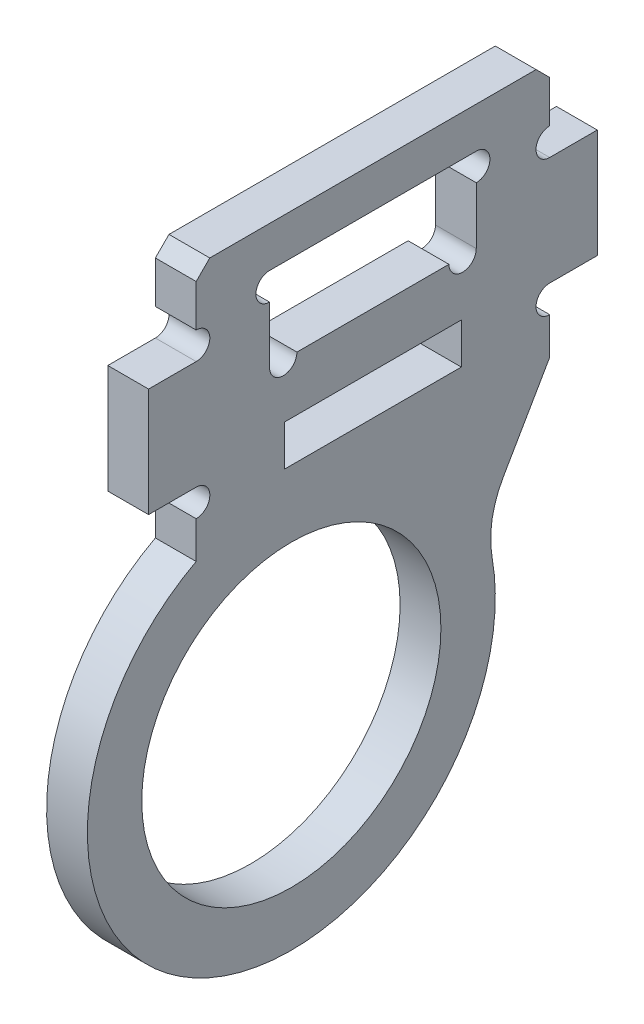
ISO-10303-21;
HEADER;
FILE_DESCRIPTION(('STEP AP214'),'2;1');
FILE_NAME('part.step','',(''),(''),'','','');
FILE_SCHEMA(('AUTOMOTIVE_DESIGN { 1 0 10303 214 1 1 1 1 }'));
ENDSEC;
DATA;
#1=APPLICATION_CONTEXT('core data for automotive mechanical design processes');
#2=APPLICATION_PROTOCOL_DEFINITION('international standard','automotive_design',2000,#1);
#3=PRODUCT_CONTEXT('',#1,'mechanical');
#4=PRODUCT('Part','Part','',(#3));
#5=PRODUCT_RELATED_PRODUCT_CATEGORY('part','',(#4));
#6=PRODUCT_DEFINITION_FORMATION('','',#4);
#7=PRODUCT_DEFINITION_CONTEXT('part definition',#1,'design');
#8=PRODUCT_DEFINITION('design','',#6,#7);
#9=PRODUCT_DEFINITION_SHAPE('','',#8);
#10=(LENGTH_UNIT() NAMED_UNIT(*) SI_UNIT(.MILLI.,.METRE.));
#11=(NAMED_UNIT(*) PLANE_ANGLE_UNIT() SI_UNIT($,.RADIAN.));
#12=(NAMED_UNIT(*) SI_UNIT($,.STERADIAN.) SOLID_ANGLE_UNIT());
#13=UNCERTAINTY_MEASURE_WITH_UNIT(LENGTH_MEASURE(1.E-05),#10,'distance_accuracy_value','');
#14=(GEOMETRIC_REPRESENTATION_CONTEXT(3) GLOBAL_UNCERTAINTY_ASSIGNED_CONTEXT((#13)) GLOBAL_UNIT_ASSIGNED_CONTEXT((#10,
#11,#12)) REPRESENTATION_CONTEXT('',''));
#15=CARTESIAN_POINT('',(0.,0.,0.));
#16=DIRECTION('',(0.,0.,1.));
#17=DIRECTION('',(1.,0.,0.));
#18=AXIS2_PLACEMENT_3D('',#15,#16,#17);
#19=CARTESIAN_POINT('',(3.,0.,13.));
#20=DIRECTION('',(0.,0.,-1.));
#21=DIRECTION('',(-1.,0.,0.));
#22=AXIS2_PLACEMENT_3D('',#19,#20,#21);
#23=PLANE('',#22);
#24=DIRECTION('',(0.,-1.,0.));
#25=VECTOR('',#24,1.);
#26=CARTESIAN_POINT('',(0.,0.,13.));
#27=LINE('',#26,#25);
#28=CARTESIAN_POINT('',(0.,-10.01,13.));
#29=VERTEX_POINT('',#28);
#30=CARTESIAN_POINT('',(0.,-12.7335008385784,13.));
#31=VERTEX_POINT('',#30);
#32=EDGE_CURVE('E436',#29,#31,#27,.T.);
#33=ORIENTED_EDGE('',*,*,#32,.T.);
#34=DIRECTION('',(-1.,0.,0.));
#35=VECTOR('',#34,1.);
#36=CARTESIAN_POINT('',(3.,-12.7335008385784,13.));
#37=LINE('',#36,#35);
#38=CARTESIAN_POINT('',(3.,-12.7335008385784,13.));
#39=VERTEX_POINT('',#38);
#40=EDGE_CURVE('E285',#39,#31,#37,.T.);
#41=ORIENTED_EDGE('',*,*,#40,.F.);
#42=DIRECTION('',(0.,-1.,0.));
#43=VECTOR('',#42,1.);
#44=CARTESIAN_POINT('',(3.,0.,13.));
#45=LINE('',#44,#43);
#46=CARTESIAN_POINT('',(3.,-10.01,13.));
#47=VERTEX_POINT('',#46);
#48=EDGE_CURVE('E506',#47,#39,#45,.T.);
#49=ORIENTED_EDGE('',*,*,#48,.F.);
#50=DIRECTION('',(-1.,0.,0.));
#51=VECTOR('',#50,1.);
#52=CARTESIAN_POINT('',(3.,-10.01,13.));
#53=LINE('',#52,#51);
#54=EDGE_CURVE('E347',#47,#29,#53,.T.);
#55=ORIENTED_EDGE('',*,*,#54,.T.);
#56=EDGE_LOOP('',(#33,#41,#49,#55));
#57=FACE_BOUND('',#56,.T.);
#58=ADVANCED_FACE('F36',(#57),#23,.F.);
#59=CARTESIAN_POINT('',(3.,-26.,6.));
#60=DIRECTION('',(-1.,0.,0.));
#61=DIRECTION('',(0.,0.,1.));
#62=AXIS2_PLACEMENT_3D('',#59,#60,#61);
#63=CYLINDRICAL_SURFACE('',#62,15.);
#64=CARTESIAN_POINT('',(0.,-26.,6.));
#65=DIRECTION('',(1.,0.,0.));
#66=DIRECTION('',(0.,0.,-1.));
#67=AXIS2_PLACEMENT_3D('',#64,#65,#66);
#68=CIRCLE('',#67,15.);
#69=CARTESIAN_POINT('',(0.,-23.3621674574513,-8.76623985574768));
#70=VERTEX_POINT('',#69);
#71=EDGE_CURVE('E439',#31,#70,#68,.T.);
#72=ORIENTED_EDGE('',*,*,#71,.T.);
#73=DIRECTION('',(-1.,0.,0.));
#74=VECTOR('',#73,1.);
#75=CARTESIAN_POINT('',(3.,-23.3621674574513,-8.76623985574768));
#76=LINE('',#75,#74);
#77=CARTESIAN_POINT('',(3.,-23.3621674574513,-8.76623985574768));
#78=VERTEX_POINT('',#77);
#79=EDGE_CURVE('E284',#70,#78,#76,.F.);
#80=ORIENTED_EDGE('',*,*,#79,.T.);
#81=CARTESIAN_POINT('',(3.,-26.,6.));
#82=DIRECTION('',(1.,0.,0.));
#83=DIRECTION('',(0.,0.,-1.));
#84=AXIS2_PLACEMENT_3D('',#81,#82,#83);
#85=CIRCLE('',#84,15.);
#86=EDGE_CURVE('E503',#39,#78,#85,.T.);
#87=ORIENTED_EDGE('',*,*,#86,.F.);
#88=ORIENTED_EDGE('',*,*,#40,.T.);
#89=EDGE_LOOP('',(#72,#80,#87,#88));
#90=FACE_BOUND('',#89,.T.);
#91=ADVANCED_FACE('F496',(#90),#63,.T.);
#92=CARTESIAN_POINT('',(3.,-8.81254033424348,-15.2637676026597));
#93=DIRECTION('',(0.,-0.500000000000001,-0.866025403784438));
#94=DIRECTION('',(0.,0.866025403784438,-0.500000000000001));
#95=AXIS2_PLACEMENT_3D('',#92,#93,#94);
#96=PLANE('',#95);
#97=DIRECTION('',(0.,-0.866025403784438,0.500000000000001));
#98=VECTOR('',#97,1.);
#99=CARTESIAN_POINT('',(3.,-8.81254033424348,-15.2637676026597));
#100=LINE('',#99,#98);
#101=CARTESIAN_POINT('',(3.,-12.7335008385784,-13.));
#102=VERTEX_POINT('',#101);
#103=CARTESIAN_POINT('',(3.,-18.6311789375952,-9.59497396193886));
#104=VERTEX_POINT('',#103);
#105=EDGE_CURVE('E501',#102,#104,#100,.T.);
#106=ORIENTED_EDGE('',*,*,#105,.T.);
#107=DIRECTION('',(-1.,0.,0.));
#108=VECTOR('',#107,1.);
#109=CARTESIAN_POINT('',(3.,-18.6311789375952,-9.59497396193886));
#110=LINE('',#109,#108);
#111=CARTESIAN_POINT('',(0.,-18.6311789375952,-9.59497396193886));
#112=VERTEX_POINT('',#111);
#113=EDGE_CURVE('E281',#104,#112,#110,.T.);
#114=ORIENTED_EDGE('',*,*,#113,.T.);
#115=DIRECTION('',(0.,-0.866025403784438,0.500000000000001));
#116=VECTOR('',#115,1.);
#117=CARTESIAN_POINT('',(0.,-8.81254033424348,-15.2637676026597));
#118=LINE('',#117,#116);
#119=CARTESIAN_POINT('',(0.,-12.7335008385784,-13.));
#120=VERTEX_POINT('',#119);
#121=EDGE_CURVE('E442',#120,#112,#118,.T.);
#122=ORIENTED_EDGE('',*,*,#121,.F.);
#123=DIRECTION('',(-1.,0.,0.));
#124=VECTOR('',#123,1.);
#125=CARTESIAN_POINT('',(3.,-12.7335008385784,-13.));
#126=LINE('',#125,#124);
#127=EDGE_CURVE('E374',#102,#120,#126,.T.);
#128=ORIENTED_EDGE('',*,*,#127,.F.);
#129=EDGE_LOOP('',(#106,#114,#122,#128));
#130=FACE_BOUND('',#129,.T.);
#131=ADVANCED_FACE('F490',(#130),#96,.T.);
#132=CARTESIAN_POINT('',(3.,0.,-13.));
#133=DIRECTION('',(0.,0.,-1.));
#134=DIRECTION('',(-1.,0.,0.));
#135=AXIS2_PLACEMENT_3D('',#132,#133,#134);
#136=PLANE('',#135);
#137=DIRECTION('',(0.,-1.,0.));
#138=VECTOR('',#137,1.);
#139=CARTESIAN_POINT('',(0.,0.,-13.));
#140=LINE('',#139,#138);
#141=CARTESIAN_POINT('',(0.,-10.01,-13.));
#142=VERTEX_POINT('',#141);
#143=EDGE_CURVE('E445',#142,#120,#140,.T.);
#144=ORIENTED_EDGE('',*,*,#143,.F.);
#145=DIRECTION('',(-1.,0.,0.));
#146=VECTOR('',#145,1.);
#147=CARTESIAN_POINT('',(3.,-10.01,-13.));
#148=LINE('',#147,#146);
#149=CARTESIAN_POINT('',(3.,-10.01,-13.));
#150=VERTEX_POINT('',#149);
#151=EDGE_CURVE('E372',#150,#142,#148,.T.);
#152=ORIENTED_EDGE('',*,*,#151,.F.);
#153=DIRECTION('',(0.,-1.,0.));
#154=VECTOR('',#153,1.);
#155=CARTESIAN_POINT('',(3.,0.,-13.));
#156=LINE('',#155,#154);
#157=EDGE_CURVE('E486',#150,#102,#156,.T.);
#158=ORIENTED_EDGE('',*,*,#157,.T.);
#159=ORIENTED_EDGE('',*,*,#127,.T.);
#160=EDGE_LOOP('',(#144,#152,#158,#159));
#161=FACE_BOUND('',#160,.T.);
#162=ADVANCED_FACE('F484',(#161),#136,.T.);
#163=CARTESIAN_POINT('',(3.,-9.005,-13.));
#164=DIRECTION('',(-1.,0.,0.));
#165=DIRECTION('',(0.,0.,1.));
#166=AXIS2_PLACEMENT_3D('',#163,#164,#165);
#167=CYLINDRICAL_SURFACE('',#166,1.005);
#168=CARTESIAN_POINT('',(0.,-9.005,-13.));
#169=DIRECTION('',(1.,0.,0.));
#170=DIRECTION('',(0.,0.,-1.));
#171=AXIS2_PLACEMENT_3D('',#168,#169,#170);
#172=CIRCLE('',#171,1.005);
#173=CARTESIAN_POINT('',(0.,-8.,-13.));
#174=VERTEX_POINT('',#173);
#175=EDGE_CURVE('E448',#174,#142,#172,.T.);
#176=ORIENTED_EDGE('',*,*,#175,.F.);
#177=DIRECTION('',(-1.,0.,0.));
#178=VECTOR('',#177,1.);
#179=CARTESIAN_POINT('',(3.,-8.,-13.));
#180=LINE('',#179,#178);
#181=CARTESIAN_POINT('',(3.,-8.,-13.));
#182=VERTEX_POINT('',#181);
#183=EDGE_CURVE('E370',#182,#174,#180,.T.);
#184=ORIENTED_EDGE('',*,*,#183,.F.);
#185=CARTESIAN_POINT('',(3.,-9.005,-13.));
#186=DIRECTION('',(1.,0.,0.));
#187=DIRECTION('',(0.,0.,-1.));
#188=AXIS2_PLACEMENT_3D('',#185,#186,#187);
#189=CIRCLE('',#188,1.005);
#190=EDGE_CURVE('E480',#182,#150,#189,.T.);
#191=ORIENTED_EDGE('',*,*,#190,.T.);
#192=ORIENTED_EDGE('',*,*,#151,.T.);
#193=EDGE_LOOP('',(#176,#184,#191,#192));
#194=FACE_BOUND('',#193,.T.);
#195=ADVANCED_FACE('F477',(#194),#167,.F.);
#196=CARTESIAN_POINT('',(3.,-8.00000000000001,0.));
#197=DIRECTION('',(0.,-1.,0.));
#198=DIRECTION('',(0.,0.,-1.));
#199=AXIS2_PLACEMENT_3D('',#196,#197,#198);
#200=PLANE('',#199);
#201=DIRECTION('',(0.,0.,1.));
#202=VECTOR('',#201,1.);
#203=CARTESIAN_POINT('',(0.,-8.00000000000001,0.));
#204=LINE('',#203,#202);
#205=CARTESIAN_POINT('',(0.,-8.,-16.5));
#206=VERTEX_POINT('',#205);
#207=EDGE_CURVE('E451',#206,#174,#204,.T.);
#208=ORIENTED_EDGE('',*,*,#207,.F.);
#209=DIRECTION('',(-1.,0.,0.));
#210=VECTOR('',#209,1.);
#211=CARTESIAN_POINT('',(3.,-8.,-16.5));
#212=LINE('',#211,#210);
#213=CARTESIAN_POINT('',(3.,-8.,-16.5));
#214=VERTEX_POINT('',#213);
#215=EDGE_CURVE('E368',#214,#206,#212,.T.);
#216=ORIENTED_EDGE('',*,*,#215,.F.);
#217=DIRECTION('',(0.,0.,1.));
#218=VECTOR('',#217,1.);
#219=CARTESIAN_POINT('',(3.,-8.00000000000001,0.));
#220=LINE('',#219,#218);
#221=EDGE_CURVE('E511',#214,#182,#220,.T.);
#222=ORIENTED_EDGE('',*,*,#221,.T.);
#223=ORIENTED_EDGE('',*,*,#183,.T.);
#224=EDGE_LOOP('',(#208,#216,#222,#223));
#225=FACE_BOUND('',#224,.T.);
#226=ADVANCED_FACE('F473',(#225),#200,.T.);
#227=CARTESIAN_POINT('',(3.,0.,-16.5));
#228=DIRECTION('',(0.,0.,-1.));
#229=DIRECTION('',(-1.,0.,0.));
#230=AXIS2_PLACEMENT_3D('',#227,#228,#229);
#231=PLANE('',#230);
#232=DIRECTION('',(0.,-1.,0.));
#233=VECTOR('',#232,1.);
#234=CARTESIAN_POINT('',(0.,0.,-16.5));
#235=LINE('',#234,#233);
#236=CARTESIAN_POINT('',(0.,0.,-16.5));
#237=VERTEX_POINT('',#236);
#238=EDGE_CURVE('E454',#237,#206,#235,.T.);
#239=ORIENTED_EDGE('',*,*,#238,.F.);
#240=DIRECTION('',(-1.,0.,0.));
#241=VECTOR('',#240,1.);
#242=CARTESIAN_POINT('',(3.,0.,-16.5));
#243=LINE('',#242,#241);
#244=CARTESIAN_POINT('',(3.,0.,-16.5));
#245=VERTEX_POINT('',#244);
#246=EDGE_CURVE('E366',#245,#237,#243,.T.);
#247=ORIENTED_EDGE('',*,*,#246,.F.);
#248=DIRECTION('',(0.,-1.,0.));
#249=VECTOR('',#248,1.);
#250=CARTESIAN_POINT('',(3.,0.,-16.5));
#251=LINE('',#250,#249);
#252=EDGE_CURVE('E469',#245,#214,#251,.T.);
#253=ORIENTED_EDGE('',*,*,#252,.T.);
#254=ORIENTED_EDGE('',*,*,#215,.T.);
#255=EDGE_LOOP('',(#239,#247,#253,#254));
#256=FACE_BOUND('',#255,.T.);
#257=ADVANCED_FACE('F467',(#256),#231,.T.);
#258=CARTESIAN_POINT('',(3.,0.,0.));
#259=DIRECTION('',(0.,1.,0.));
#260=DIRECTION('',(0.,0.,1.));
#261=AXIS2_PLACEMENT_3D('',#258,#259,#260);
#262=PLANE('',#261);
#263=DIRECTION('',(0.,0.,-1.));
#264=VECTOR('',#263,1.);
#265=CARTESIAN_POINT('',(0.,0.,0.));
#266=LINE('',#265,#264);
#267=CARTESIAN_POINT('',(0.,0.,-13.));
#268=VERTEX_POINT('',#267);
#269=EDGE_CURVE('E330',#268,#237,#266,.T.);
#270=ORIENTED_EDGE('',*,*,#269,.F.);
#271=DIRECTION('',(-1.,0.,0.));
#272=VECTOR('',#271,1.);
#273=CARTESIAN_POINT('',(3.,0.,-13.));
#274=LINE('',#273,#272);
#275=CARTESIAN_POINT('',(3.,0.,-13.));
#276=VERTEX_POINT('',#275);
#277=EDGE_CURVE('E364',#276,#268,#274,.T.);
#278=ORIENTED_EDGE('',*,*,#277,.F.);
#279=DIRECTION('',(0.,0.,-1.));
#280=VECTOR('',#279,1.);
#281=CARTESIAN_POINT('',(3.,0.,0.));
#282=LINE('',#281,#280);
#283=EDGE_CURVE('E463',#276,#245,#282,.T.);
#284=ORIENTED_EDGE('',*,*,#283,.T.);
#285=ORIENTED_EDGE('',*,*,#246,.T.);
#286=EDGE_LOOP('',(#270,#278,#284,#285));
#287=FACE_BOUND('',#286,.T.);
#288=ADVANCED_FACE('F460',(#287),#262,.T.);
#289=CARTESIAN_POINT('',(3.,1.005,-13.));
#290=DIRECTION('',(-1.,0.,0.));
#291=DIRECTION('',(0.,0.,1.));
#292=AXIS2_PLACEMENT_3D('',#289,#290,#291);
#293=CYLINDRICAL_SURFACE('',#292,1.005);
#294=CARTESIAN_POINT('',(0.,1.005,-13.));
#295=DIRECTION('',(1.,0.,0.));
#296=DIRECTION('',(0.,0.,-1.));
#297=AXIS2_PLACEMENT_3D('',#294,#295,#296);
#298=CIRCLE('',#297,1.005);
#299=CARTESIAN_POINT('',(0.,2.01,-13.));
#300=VERTEX_POINT('',#299);
#301=EDGE_CURVE('E326',#300,#268,#298,.T.);
#302=ORIENTED_EDGE('',*,*,#301,.F.);
#303=DIRECTION('',(-1.,0.,0.));
#304=VECTOR('',#303,1.);
#305=CARTESIAN_POINT('',(3.,2.01,-13.));
#306=LINE('',#305,#304);
#307=CARTESIAN_POINT('',(3.,2.01,-13.));
#308=VERTEX_POINT('',#307);
#309=EDGE_CURVE('E324',#308,#300,#306,.T.);
#310=ORIENTED_EDGE('',*,*,#309,.F.);
#311=CARTESIAN_POINT('',(3.,1.005,-13.));
#312=DIRECTION('',(1.,0.,0.));
#313=DIRECTION('',(0.,0.,-1.));
#314=AXIS2_PLACEMENT_3D('',#311,#312,#313);
#315=CIRCLE('',#314,1.005);
#316=EDGE_CURVE('E515',#308,#276,#315,.T.);
#317=ORIENTED_EDGE('',*,*,#316,.T.);
#318=ORIENTED_EDGE('',*,*,#277,.T.);
#319=EDGE_LOOP('',(#302,#310,#317,#318));
#320=FACE_BOUND('',#319,.T.);
#321=ADVANCED_FACE('F694',(#320),#293,.F.);
#322=CARTESIAN_POINT('',(3.,0.,-13.));
#323=DIRECTION('',(0.,0.,-1.));
#324=DIRECTION('',(-1.,0.,0.));
#325=AXIS2_PLACEMENT_3D('',#322,#323,#324);
#326=PLANE('',#325);
#327=DIRECTION('',(0.,-1.,0.));
#328=VECTOR('',#327,1.);
#329=CARTESIAN_POINT('',(0.,0.,-13.));
#330=LINE('',#329,#328);
#331=CARTESIAN_POINT('',(0.,5.09999999999999,-13.));
#332=VERTEX_POINT('',#331);
#333=EDGE_CURVE('E319',#332,#300,#330,.T.);
#334=ORIENTED_EDGE('',*,*,#333,.F.);
#335=DIRECTION('',(1.,0.,0.));
#336=VECTOR('',#335,1.);
#337=CARTESIAN_POINT('',(3.,5.09999999999999,-13.));
#338=LINE('',#337,#336);
#339=CARTESIAN_POINT('',(3.,5.09999999999999,-13.));
#340=VERTEX_POINT('',#339);
#341=EDGE_CURVE('E59',#332,#340,#338,.T.);
#342=ORIENTED_EDGE('',*,*,#341,.T.);
#343=DIRECTION('',(0.,-1.,0.));
#344=VECTOR('',#343,1.);
#345=CARTESIAN_POINT('',(3.,0.,-13.));
#346=LINE('',#345,#344);
#347=EDGE_CURVE('E305',#340,#308,#346,.T.);
#348=ORIENTED_EDGE('',*,*,#347,.T.);
#349=ORIENTED_EDGE('',*,*,#309,.T.);
#350=EDGE_LOOP('',(#334,#342,#348,#349));
#351=FACE_BOUND('',#350,.T.);
#352=ADVANCED_FACE('F322',(#351),#326,.T.);
#353=CARTESIAN_POINT('',(3.,6.1,0.));
#354=DIRECTION('',(0.,1.,0.));
#355=DIRECTION('',(0.,0.,1.));
#356=AXIS2_PLACEMENT_3D('',#353,#354,#355);
#357=PLANE('',#356);
#358=DIRECTION('',(0.,0.,-1.));
#359=VECTOR('',#358,1.);
#360=CARTESIAN_POINT('',(3.,6.1,0.));
#361=LINE('',#360,#359);
#362=CARTESIAN_POINT('',(3.,6.1,12.));
#363=VERTEX_POINT('',#362);
#364=CARTESIAN_POINT('',(3.,6.1,-12.));
#365=VERTEX_POINT('',#364);
#366=EDGE_CURVE('E303',#363,#365,#361,.T.);
#367=ORIENTED_EDGE('',*,*,#366,.T.);
#368=DIRECTION('',(-1.,0.,0.));
#369=VECTOR('',#368,1.);
#370=CARTESIAN_POINT('',(3.,6.1,-12.));
#371=LINE('',#370,#369);
#372=CARTESIAN_POINT('',(0.,6.1,-12.));
#373=VERTEX_POINT('',#372);
#374=EDGE_CURVE('E293',#365,#373,#371,.T.);
#375=ORIENTED_EDGE('',*,*,#374,.T.);
#376=DIRECTION('',(0.,0.,-1.));
#377=VECTOR('',#376,1.);
#378=CARTESIAN_POINT('',(0.,6.1,0.));
#379=LINE('',#378,#377);
#380=CARTESIAN_POINT('',(0.,6.1,12.));
#381=VERTEX_POINT('',#380);
#382=EDGE_CURVE('E321',#381,#373,#379,.T.);
#383=ORIENTED_EDGE('',*,*,#382,.F.);
#384=DIRECTION('',(1.,0.,0.));
#385=VECTOR('',#384,1.);
#386=CARTESIAN_POINT('',(3.,6.1,12.));
#387=LINE('',#386,#385);
#388=EDGE_CURVE('E291',#381,#363,#387,.T.);
#389=ORIENTED_EDGE('',*,*,#388,.T.);
#390=EDGE_LOOP('',(#367,#375,#383,#389));
#391=FACE_BOUND('',#390,.T.);
#392=ADVANCED_FACE('F309',(#391),#357,.T.);
#393=CARTESIAN_POINT('',(3.,0.,13.));
#394=DIRECTION('',(0.,0.,-1.));
#395=DIRECTION('',(-1.,0.,0.));
#396=AXIS2_PLACEMENT_3D('',#393,#394,#395);
#397=PLANE('',#396);
#398=DIRECTION('',(0.,-1.,0.));
#399=VECTOR('',#398,1.);
#400=CARTESIAN_POINT('',(3.,0.,13.));
#401=LINE('',#400,#399);
#402=CARTESIAN_POINT('',(3.,5.09999999999999,13.));
#403=VERTEX_POINT('',#402);
#404=CARTESIAN_POINT('',(3.,2.01,13.));
#405=VERTEX_POINT('',#404);
#406=EDGE_CURVE('E313',#403,#405,#401,.T.);
#407=ORIENTED_EDGE('',*,*,#406,.F.);
#408=DIRECTION('',(-1.,0.,0.));
#409=VECTOR('',#408,1.);
#410=CARTESIAN_POINT('',(0.,5.09999999999999,13.));
#411=LINE('',#410,#409);
#412=CARTESIAN_POINT('',(0.,5.09999999999999,13.));
#413=VERTEX_POINT('',#412);
#414=EDGE_CURVE('E11',#403,#413,#411,.T.);
#415=ORIENTED_EDGE('',*,*,#414,.T.);
#416=DIRECTION('',(0.,-1.,0.));
#417=VECTOR('',#416,1.);
#418=CARTESIAN_POINT('',(0.,0.,13.));
#419=LINE('',#418,#417);
#420=CARTESIAN_POINT('',(0.,2.01,13.));
#421=VERTEX_POINT('',#420);
#422=EDGE_CURVE('E328',#413,#421,#419,.T.);
#423=ORIENTED_EDGE('',*,*,#422,.T.);
#424=DIRECTION('',(-1.,0.,0.));
#425=VECTOR('',#424,1.);
#426=CARTESIAN_POINT('',(3.,2.01,13.));
#427=LINE('',#426,#425);
#428=EDGE_CURVE('E360',#405,#421,#427,.T.);
#429=ORIENTED_EDGE('',*,*,#428,.F.);
#430=EDGE_LOOP('',(#407,#415,#423,#429));
#431=FACE_BOUND('',#430,.T.);
#432=ADVANCED_FACE('F664',(#431),#397,.F.);
#433=CARTESIAN_POINT('',(3.,1.005,13.));
#434=DIRECTION('',(-1.,0.,0.));
#435=DIRECTION('',(0.,0.,1.));
#436=AXIS2_PLACEMENT_3D('',#433,#434,#435);
#437=CYLINDRICAL_SURFACE('',#436,1.005);
#438=CARTESIAN_POINT('',(0.,1.005,13.));
#439=DIRECTION('',(1.,0.,0.));
#440=DIRECTION('',(0.,0.,-1.));
#441=AXIS2_PLACEMENT_3D('',#438,#439,#440);
#442=CIRCLE('',#441,1.005);
#443=CARTESIAN_POINT('',(0.,0.,13.));
#444=VERTEX_POINT('',#443);
#445=EDGE_CURVE('E335',#444,#421,#442,.T.);
#446=ORIENTED_EDGE('',*,*,#445,.F.);
#447=DIRECTION('',(-1.,0.,0.));
#448=VECTOR('',#447,1.);
#449=CARTESIAN_POINT('',(3.,0.,13.));
#450=LINE('',#449,#448);
#451=CARTESIAN_POINT('',(3.,0.,13.));
#452=VERTEX_POINT('',#451);
#453=EDGE_CURVE('E358',#452,#444,#450,.T.);
#454=ORIENTED_EDGE('',*,*,#453,.F.);
#455=CARTESIAN_POINT('',(3.,1.005,13.));
#456=DIRECTION('',(1.,0.,0.));
#457=DIRECTION('',(0.,0.,-1.));
#458=AXIS2_PLACEMENT_3D('',#455,#456,#457);
#459=CIRCLE('',#458,1.005);
#460=EDGE_CURVE('E520',#452,#405,#459,.T.);
#461=ORIENTED_EDGE('',*,*,#460,.T.);
#462=ORIENTED_EDGE('',*,*,#428,.T.);
#463=EDGE_LOOP('',(#446,#454,#461,#462));
#464=FACE_BOUND('',#463,.T.);
#465=ADVANCED_FACE('F669',(#464),#437,.F.);
#466=CARTESIAN_POINT('',(3.,0.,0.));
#467=DIRECTION('',(0.,-1.,0.));
#468=DIRECTION('',(0.,0.,-1.));
#469=AXIS2_PLACEMENT_3D('',#466,#467,#468);
#470=PLANE('',#469);
#471=DIRECTION('',(0.,0.,1.));
#472=VECTOR('',#471,1.);
#473=CARTESIAN_POINT('',(0.,0.,0.));
#474=LINE('',#473,#472);
#475=CARTESIAN_POINT('',(0.,0.,16.5));
#476=VERTEX_POINT('',#475);
#477=EDGE_CURVE('E338',#444,#476,#474,.T.);
#478=ORIENTED_EDGE('',*,*,#477,.T.);
#479=DIRECTION('',(-1.,0.,0.));
#480=VECTOR('',#479,1.);
#481=CARTESIAN_POINT('',(3.,0.,16.5));
#482=LINE('',#481,#480);
#483=CARTESIAN_POINT('',(3.,0.,16.5));
#484=VERTEX_POINT('',#483);
#485=EDGE_CURVE('E355',#484,#476,#482,.T.);
#486=ORIENTED_EDGE('',*,*,#485,.F.);
#487=DIRECTION('',(0.,0.,1.));
#488=VECTOR('',#487,1.);
#489=CARTESIAN_POINT('',(3.,0.,0.));
#490=LINE('',#489,#488);
#491=EDGE_CURVE('E523',#452,#484,#490,.T.);
#492=ORIENTED_EDGE('',*,*,#491,.F.);
#493=ORIENTED_EDGE('',*,*,#453,.T.);
#494=EDGE_LOOP('',(#478,#486,#492,#493));
#495=FACE_BOUND('',#494,.T.);
#496=ADVANCED_FACE('F674',(#495),#470,.F.);
#497=CARTESIAN_POINT('',(3.,0.,16.5));
#498=DIRECTION('',(0.,0.,-1.));
#499=DIRECTION('',(-1.,0.,0.));
#500=AXIS2_PLACEMENT_3D('',#497,#498,#499);
#501=PLANE('',#500);
#502=DIRECTION('',(0.,-1.,0.));
#503=VECTOR('',#502,1.);
#504=CARTESIAN_POINT('',(0.,0.,16.5));
#505=LINE('',#504,#503);
#506=CARTESIAN_POINT('',(0.,-8.,16.5));
#507=VERTEX_POINT('',#506);
#508=EDGE_CURVE('E340',#476,#507,#505,.T.);
#509=ORIENTED_EDGE('',*,*,#508,.T.);
#510=DIRECTION('',(-1.,0.,0.));
#511=VECTOR('',#510,1.);
#512=CARTESIAN_POINT('',(3.,-8.,16.5));
#513=LINE('',#512,#511);
#514=CARTESIAN_POINT('',(3.,-8.,16.5));
#515=VERTEX_POINT('',#514);
#516=EDGE_CURVE('E352',#515,#507,#513,.T.);
#517=ORIENTED_EDGE('',*,*,#516,.F.);
#518=DIRECTION('',(0.,-1.,0.));
#519=VECTOR('',#518,1.);
#520=CARTESIAN_POINT('',(3.,0.,16.5));
#521=LINE('',#520,#519);
#522=EDGE_CURVE('E525',#484,#515,#521,.T.);
#523=ORIENTED_EDGE('',*,*,#522,.F.);
#524=ORIENTED_EDGE('',*,*,#485,.T.);
#525=EDGE_LOOP('',(#509,#517,#523,#524));
#526=FACE_BOUND('',#525,.T.);
#527=ADVANCED_FACE('F676',(#526),#501,.F.);
#528=CARTESIAN_POINT('',(3.,-8.00000000000002,0.));
#529=DIRECTION('',(0.,1.,0.));
#530=DIRECTION('',(0.,0.,1.));
#531=AXIS2_PLACEMENT_3D('',#528,#529,#530);
#532=PLANE('',#531);
#533=DIRECTION('',(0.,0.,-1.));
#534=VECTOR('',#533,1.);
#535=CARTESIAN_POINT('',(0.,-8.00000000000002,0.));
#536=LINE('',#535,#534);
#537=CARTESIAN_POINT('',(0.,-8.00000000000001,13.));
#538=VERTEX_POINT('',#537);
#539=EDGE_CURVE('E342',#507,#538,#536,.T.);
#540=ORIENTED_EDGE('',*,*,#539,.T.);
#541=DIRECTION('',(-1.,0.,0.));
#542=VECTOR('',#541,1.);
#543=CARTESIAN_POINT('',(3.,-8.00000000000001,13.));
#544=LINE('',#543,#542);
#545=CARTESIAN_POINT('',(3.,-8.00000000000001,13.));
#546=VERTEX_POINT('',#545);
#547=EDGE_CURVE('E349',#546,#538,#544,.T.);
#548=ORIENTED_EDGE('',*,*,#547,.F.);
#549=DIRECTION('',(0.,0.,-1.));
#550=VECTOR('',#549,1.);
#551=CARTESIAN_POINT('',(3.,-8.00000000000002,0.));
#552=LINE('',#551,#550);
#553=EDGE_CURVE('E527',#515,#546,#552,.T.);
#554=ORIENTED_EDGE('',*,*,#553,.F.);
#555=ORIENTED_EDGE('',*,*,#516,.T.);
#556=EDGE_LOOP('',(#540,#548,#554,#555));
#557=FACE_BOUND('',#556,.T.);
#558=ADVANCED_FACE('F541',(#557),#532,.F.);
#559=CARTESIAN_POINT('',(3.,2.095,7.6));
#560=DIRECTION('',(-1.,0.,0.));
#561=DIRECTION('',(0.,0.,1.));
#562=AXIS2_PLACEMENT_3D('',#559,#560,#561);
#563=CYLINDRICAL_SURFACE('',#562,1.005);
#564=CARTESIAN_POINT('',(0.,2.095,7.6));
#565=DIRECTION('',(1.,0.,0.));
#566=DIRECTION('',(0.,0.,-1.));
#567=AXIS2_PLACEMENT_3D('',#564,#565,#566);
#568=CIRCLE('',#567,1.005);
#569=CARTESIAN_POINT('',(0.,3.1,7.6));
#570=VERTEX_POINT('',#569);
#571=CARTESIAN_POINT('',(0.,1.09,7.6));
#572=VERTEX_POINT('',#571);
#573=EDGE_CURVE('E409',#570,#572,#568,.T.);
#574=ORIENTED_EDGE('',*,*,#573,.F.);
#575=DIRECTION('',(-1.,0.,0.));
#576=VECTOR('',#575,1.);
#577=CARTESIAN_POINT('',(3.,3.1,7.6));
#578=LINE('',#577,#576);
#579=CARTESIAN_POINT('',(3.,3.1,7.6));
#580=VERTEX_POINT('',#579);
#581=EDGE_CURVE('E350',#580,#570,#578,.T.);
#582=ORIENTED_EDGE('',*,*,#581,.F.);
#583=CARTESIAN_POINT('',(3.,2.095,7.6));
#584=DIRECTION('',(1.,0.,0.));
#585=DIRECTION('',(0.,0.,-1.));
#586=AXIS2_PLACEMENT_3D('',#583,#584,#585);
#587=CIRCLE('',#586,1.005);
#588=CARTESIAN_POINT('',(3.,1.09,7.6));
#589=VERTEX_POINT('',#588);
#590=EDGE_CURVE('E565',#580,#589,#587,.T.);
#591=ORIENTED_EDGE('',*,*,#590,.T.);
#592=DIRECTION('',(-1.,0.,0.));
#593=VECTOR('',#592,1.);
#594=CARTESIAN_POINT('',(3.,1.09,7.6));
#595=LINE('',#594,#593);
#596=EDGE_CURVE('E273',#589,#572,#595,.T.);
#597=ORIENTED_EDGE('',*,*,#596,.T.);
#598=EDGE_LOOP('',(#574,#582,#591,#597));
#599=FACE_BOUND('',#598,.T.);
#600=ADVANCED_FACE('F612',(#599),#563,.F.);
#601=CARTESIAN_POINT('',(3.,3.1,0.));
#602=DIRECTION('',(0.,-1.,0.));
#603=DIRECTION('',(0.,0.,-1.));
#604=AXIS2_PLACEMENT_3D('',#601,#602,#603);
#605=PLANE('',#604);
#606=DIRECTION('',(0.,0.,1.));
#607=VECTOR('',#606,1.);
#608=CARTESIAN_POINT('',(0.,3.1,0.));
#609=LINE('',#608,#607);
#610=CARTESIAN_POINT('',(0.,3.1,-7.6));
#611=VERTEX_POINT('',#610);
#612=EDGE_CURVE('E415',#611,#570,#609,.T.);
#613=ORIENTED_EDGE('',*,*,#612,.F.);
#614=DIRECTION('',(-1.,0.,0.));
#615=VECTOR('',#614,1.);
#616=CARTESIAN_POINT('',(3.,3.1,-7.6));
#617=LINE('',#616,#615);
#618=CARTESIAN_POINT('',(3.,3.1,-7.6));
#619=VERTEX_POINT('',#618);
#620=EDGE_CURVE('E387',#619,#611,#617,.T.);
#621=ORIENTED_EDGE('',*,*,#620,.F.);
#622=DIRECTION('',(0.,0.,1.));
#623=VECTOR('',#622,1.);
#624=CARTESIAN_POINT('',(3.,3.1,0.));
#625=LINE('',#624,#623);
#626=EDGE_CURVE('E562',#619,#580,#625,.T.);
#627=ORIENTED_EDGE('',*,*,#626,.T.);
#628=ORIENTED_EDGE('',*,*,#581,.T.);
#629=EDGE_LOOP('',(#613,#621,#627,#628));
#630=FACE_BOUND('',#629,.T.);
#631=ADVANCED_FACE('F588',(#630),#605,.T.);
#632=CARTESIAN_POINT('',(3.,2.095,-7.6));
#633=DIRECTION('',(-1.,0.,0.));
#634=DIRECTION('',(0.,0.,1.));
#635=AXIS2_PLACEMENT_3D('',#632,#633,#634);
#636=CYLINDRICAL_SURFACE('',#635,1.005);
#637=CARTESIAN_POINT('',(0.,2.095,-7.6));
#638=DIRECTION('',(1.,0.,0.));
#639=DIRECTION('',(0.,0.,-1.));
#640=AXIS2_PLACEMENT_3D('',#637,#638,#639);
#641=CIRCLE('',#640,1.005);
#642=CARTESIAN_POINT('',(0.,1.09,-7.6));
#643=VERTEX_POINT('',#642);
#644=EDGE_CURVE('E418',#643,#611,#641,.T.);
#645=ORIENTED_EDGE('',*,*,#644,.F.);
#646=DIRECTION('',(-1.,0.,0.));
#647=VECTOR('',#646,1.);
#648=CARTESIAN_POINT('',(3.,1.09,-7.6));
#649=LINE('',#648,#647);
#650=CARTESIAN_POINT('',(3.,1.09,-7.6));
#651=VERTEX_POINT('',#650);
#652=EDGE_CURVE('E385',#651,#643,#649,.T.);
#653=ORIENTED_EDGE('',*,*,#652,.F.);
#654=CARTESIAN_POINT('',(3.,2.095,-7.6));
#655=DIRECTION('',(1.,0.,0.));
#656=DIRECTION('',(0.,0.,-1.));
#657=AXIS2_PLACEMENT_3D('',#654,#655,#656);
#658=CIRCLE('',#657,1.005);
#659=EDGE_CURVE('E559',#651,#619,#658,.T.);
#660=ORIENTED_EDGE('',*,*,#659,.T.);
#661=ORIENTED_EDGE('',*,*,#620,.T.);
#662=EDGE_LOOP('',(#645,#653,#660,#661));
#663=FACE_BOUND('',#662,.T.);
#664=ADVANCED_FACE('F592',(#663),#636,.F.);
#665=CARTESIAN_POINT('',(3.,0.,-7.6));
#666=DIRECTION('',(0.,0.,1.));
#667=DIRECTION('',(1.,0.,0.));
#668=AXIS2_PLACEMENT_3D('',#665,#666,#667);
#669=PLANE('',#668);
#670=DIRECTION('',(0.,1.,0.));
#671=VECTOR('',#670,1.);
#672=CARTESIAN_POINT('',(0.,0.,-7.6));
#673=LINE('',#672,#671);
#674=CARTESIAN_POINT('',(0.,-3.1,-7.6));
#675=VERTEX_POINT('',#674);
#676=EDGE_CURVE('E421',#675,#643,#673,.T.);
#677=ORIENTED_EDGE('',*,*,#676,.F.);
#678=DIRECTION('',(-1.,0.,0.));
#679=VECTOR('',#678,1.);
#680=CARTESIAN_POINT('',(3.,-3.1,-7.6));
#681=LINE('',#680,#679);
#682=CARTESIAN_POINT('',(3.,-3.1,-7.6));
#683=VERTEX_POINT('',#682);
#684=EDGE_CURVE('E383',#683,#675,#681,.T.);
#685=ORIENTED_EDGE('',*,*,#684,.F.);
#686=DIRECTION('',(0.,1.,0.));
#687=VECTOR('',#686,1.);
#688=CARTESIAN_POINT('',(3.,0.,-7.6));
#689=LINE('',#688,#687);
#690=EDGE_CURVE('E556',#683,#651,#689,.T.);
#691=ORIENTED_EDGE('',*,*,#690,.T.);
#692=ORIENTED_EDGE('',*,*,#652,.T.);
#693=EDGE_LOOP('',(#677,#685,#691,#692));
#694=FACE_BOUND('',#693,.T.);
#695=ADVANCED_FACE('F597',(#694),#669,.T.);
#696=CARTESIAN_POINT('',(3.,-3.1,-6.595));
#697=DIRECTION('',(-1.,0.,0.));
#698=DIRECTION('',(0.,0.,1.));
#699=AXIS2_PLACEMENT_3D('',#696,#697,#698);
#700=CYLINDRICAL_SURFACE('',#699,1.005);
#701=CARTESIAN_POINT('',(0.,-3.1,-6.595));
#702=DIRECTION('',(1.,0.,0.));
#703=DIRECTION('',(0.,0.,-1.));
#704=AXIS2_PLACEMENT_3D('',#701,#702,#703);
#705=CIRCLE('',#704,1.005);
#706=CARTESIAN_POINT('',(0.,-3.1,-5.59));
#707=VERTEX_POINT('',#706);
#708=EDGE_CURVE('E424',#707,#675,#705,.T.);
#709=ORIENTED_EDGE('',*,*,#708,.F.);
#710=DIRECTION('',(-1.,0.,0.));
#711=VECTOR('',#710,1.);
#712=CARTESIAN_POINT('',(3.,-3.1,-5.59));
#713=LINE('',#712,#711);
#714=CARTESIAN_POINT('',(3.,-3.1,-5.59));
#715=VERTEX_POINT('',#714);
#716=EDGE_CURVE('E381',#715,#707,#713,.T.);
#717=ORIENTED_EDGE('',*,*,#716,.F.);
#718=CARTESIAN_POINT('',(3.,-3.1,-6.595));
#719=DIRECTION('',(1.,0.,0.));
#720=DIRECTION('',(0.,0.,-1.));
#721=AXIS2_PLACEMENT_3D('',#718,#719,#720);
#722=CIRCLE('',#721,1.005);
#723=EDGE_CURVE('E553',#715,#683,#722,.T.);
#724=ORIENTED_EDGE('',*,*,#723,.T.);
#725=ORIENTED_EDGE('',*,*,#684,.T.);
#726=EDGE_LOOP('',(#709,#717,#724,#725));
#727=FACE_BOUND('',#726,.T.);
#728=ADVANCED_FACE('F600',(#727),#700,.F.);
#729=CARTESIAN_POINT('',(3.,-3.1,0.));
#730=DIRECTION('',(0.,-1.,0.));
#731=DIRECTION('',(0.,0.,-1.));
#732=AXIS2_PLACEMENT_3D('',#729,#730,#731);
#733=PLANE('',#732);
#734=DIRECTION('',(0.,0.,1.));
#735=VECTOR('',#734,1.);
#736=CARTESIAN_POINT('',(0.,-3.1,0.));
#737=LINE('',#736,#735);
#738=CARTESIAN_POINT('',(0.,-3.1,5.59));
#739=VERTEX_POINT('',#738);
#740=EDGE_CURVE('E427',#707,#739,#737,.T.);
#741=ORIENTED_EDGE('',*,*,#740,.T.);
#742=DIRECTION('',(-1.,0.,0.));
#743=VECTOR('',#742,1.);
#744=CARTESIAN_POINT('',(3.,-3.1,5.59));
#745=LINE('',#744,#743);
#746=CARTESIAN_POINT('',(3.,-3.1,5.59));
#747=VERTEX_POINT('',#746);
#748=EDGE_CURVE('E379',#747,#739,#745,.T.);
#749=ORIENTED_EDGE('',*,*,#748,.F.);
#750=DIRECTION('',(0.,0.,1.));
#751=VECTOR('',#750,1.);
#752=CARTESIAN_POINT('',(3.,-3.1,0.));
#753=LINE('',#752,#751);
#754=EDGE_CURVE('E551',#715,#747,#753,.T.);
#755=ORIENTED_EDGE('',*,*,#754,.F.);
#756=ORIENTED_EDGE('',*,*,#716,.T.);
#757=EDGE_LOOP('',(#741,#749,#755,#756));
#758=FACE_BOUND('',#757,.T.);
#759=ADVANCED_FACE('F604',(#758),#733,.F.);
#760=CARTESIAN_POINT('',(3.,-3.1,6.595));
#761=DIRECTION('',(-1.,0.,0.));
#762=DIRECTION('',(0.,0.,1.));
#763=AXIS2_PLACEMENT_3D('',#760,#761,#762);
#764=CYLINDRICAL_SURFACE('',#763,1.005);
#765=CARTESIAN_POINT('',(0.,-3.1,6.595));
#766=DIRECTION('',(1.,0.,0.));
#767=DIRECTION('',(0.,0.,-1.));
#768=AXIS2_PLACEMENT_3D('',#765,#766,#767);
#769=CIRCLE('',#768,1.005);
#770=CARTESIAN_POINT('',(0.,-3.1,7.6));
#771=VERTEX_POINT('',#770);
#772=EDGE_CURVE('E430',#771,#739,#769,.T.);
#773=ORIENTED_EDGE('',*,*,#772,.F.);
#774=DIRECTION('',(-1.,0.,0.));
#775=VECTOR('',#774,1.);
#776=CARTESIAN_POINT('',(3.,-3.1,7.6));
#777=LINE('',#776,#775);
#778=CARTESIAN_POINT('',(3.,-3.1,7.6));
#779=VERTEX_POINT('',#778);
#780=EDGE_CURVE('E275',#779,#771,#777,.T.);
#781=ORIENTED_EDGE('',*,*,#780,.F.);
#782=CARTESIAN_POINT('',(3.,-3.1,6.595));
#783=DIRECTION('',(1.,0.,0.));
#784=DIRECTION('',(0.,0.,-1.));
#785=AXIS2_PLACEMENT_3D('',#782,#783,#784);
#786=CIRCLE('',#785,1.005);
#787=EDGE_CURVE('E546',#779,#747,#786,.T.);
#788=ORIENTED_EDGE('',*,*,#787,.T.);
#789=ORIENTED_EDGE('',*,*,#748,.T.);
#790=EDGE_LOOP('',(#773,#781,#788,#789));
#791=FACE_BOUND('',#790,.T.);
#792=ADVANCED_FACE('F608',(#791),#764,.F.);
#793=CARTESIAN_POINT('',(3.,-10.1,0.));
#794=DIRECTION('',(0.,-1.,0.));
#795=DIRECTION('',(0.,0.,-1.));
#796=AXIS2_PLACEMENT_3D('',#793,#794,#795);
#797=PLANE('',#796);
#798=DIRECTION('',(0.,0.,1.));
#799=VECTOR('',#798,1.);
#800=CARTESIAN_POINT('',(0.,-10.1,0.));
#801=LINE('',#800,#799);
#802=CARTESIAN_POINT('',(0.,-10.1,-6.5));
#803=VERTEX_POINT('',#802);
#804=CARTESIAN_POINT('',(0.,-10.1,6.5));
#805=VERTEX_POINT('',#804);
#806=EDGE_CURVE('E272',#803,#805,#801,.T.);
#807=ORIENTED_EDGE('',*,*,#806,.T.);
#808=DIRECTION('',(-1.,0.,0.));
#809=VECTOR('',#808,1.);
#810=CARTESIAN_POINT('',(3.,-10.1,6.5));
#811=LINE('',#810,#809);
#812=CARTESIAN_POINT('',(3.,-10.1,6.5));
#813=VERTEX_POINT('',#812);
#814=EDGE_CURVE('E252',#813,#805,#811,.T.);
#815=ORIENTED_EDGE('',*,*,#814,.F.);
#816=DIRECTION('',(0.,0.,1.));
#817=VECTOR('',#816,1.);
#818=CARTESIAN_POINT('',(3.,-10.1,0.));
#819=LINE('',#818,#817);
#820=CARTESIAN_POINT('',(3.,-10.1,-6.5));
#821=VERTEX_POINT('',#820);
#822=EDGE_CURVE('E259',#821,#813,#819,.T.);
#823=ORIENTED_EDGE('',*,*,#822,.F.);
#824=DIRECTION('',(-1.,0.,0.));
#825=VECTOR('',#824,1.);
#826=CARTESIAN_POINT('',(3.,-10.1,-6.5));
#827=LINE('',#826,#825);
#828=EDGE_CURVE('E390',#821,#803,#827,.T.);
#829=ORIENTED_EDGE('',*,*,#828,.T.);
#830=EDGE_LOOP('',(#807,#815,#823,#829));
#831=FACE_BOUND('',#830,.T.);
#832=ADVANCED_FACE('F270',(#831),#797,.F.);
#833=CARTESIAN_POINT('',(3.,0.,6.5));
#834=DIRECTION('',(0.,0.,1.));
#835=DIRECTION('',(1.,0.,0.));
#836=AXIS2_PLACEMENT_3D('',#833,#834,#835);
#837=PLANE('',#836);
#838=DIRECTION('',(0.,1.,0.));
#839=VECTOR('',#838,1.);
#840=CARTESIAN_POINT('',(0.,0.,6.5));
#841=LINE('',#840,#839);
#842=CARTESIAN_POINT('',(0.,-7.1,6.5));
#843=VERTEX_POINT('',#842);
#844=EDGE_CURVE('E403',#805,#843,#841,.T.);
#845=ORIENTED_EDGE('',*,*,#844,.T.);
#846=DIRECTION('',(-1.,0.,0.));
#847=VECTOR('',#846,1.);
#848=CARTESIAN_POINT('',(3.,-7.1,6.5));
#849=LINE('',#848,#847);
#850=CARTESIAN_POINT('',(3.,-7.1,6.5));
#851=VERTEX_POINT('',#850);
#852=EDGE_CURVE('E254',#851,#843,#849,.T.);
#853=ORIENTED_EDGE('',*,*,#852,.F.);
#854=DIRECTION('',(0.,1.,0.));
#855=VECTOR('',#854,1.);
#856=CARTESIAN_POINT('',(3.,0.,6.5));
#857=LINE('',#856,#855);
#858=EDGE_CURVE('E247',#813,#851,#857,.T.);
#859=ORIENTED_EDGE('',*,*,#858,.F.);
#860=ORIENTED_EDGE('',*,*,#814,.T.);
#861=EDGE_LOOP('',(#845,#853,#859,#860));
#862=FACE_BOUND('',#861,.T.);
#863=ADVANCED_FACE('F250',(#862),#837,.F.);
#864=CARTESIAN_POINT('',(3.,-7.1,0.));
#865=DIRECTION('',(0.,-1.,0.));
#866=DIRECTION('',(0.,0.,-1.));
#867=AXIS2_PLACEMENT_3D('',#864,#865,#866);
#868=PLANE('',#867);
#869=DIRECTION('',(0.,0.,1.));
#870=VECTOR('',#869,1.);
#871=CARTESIAN_POINT('',(0.,-7.1,0.));
#872=LINE('',#871,#870);
#873=CARTESIAN_POINT('',(0.,-7.1,-6.5));
#874=VERTEX_POINT('',#873);
#875=EDGE_CURVE('E400',#874,#843,#872,.T.);
#876=ORIENTED_EDGE('',*,*,#875,.F.);
#877=DIRECTION('',(-1.,0.,0.));
#878=VECTOR('',#877,1.);
#879=CARTESIAN_POINT('',(3.,-7.1,-6.5));
#880=LINE('',#879,#878);
#881=CARTESIAN_POINT('',(3.,-7.1,-6.5));
#882=VERTEX_POINT('',#881);
#883=EDGE_CURVE('E277',#882,#874,#880,.T.);
#884=ORIENTED_EDGE('',*,*,#883,.F.);
#885=DIRECTION('',(0.,0.,1.));
#886=VECTOR('',#885,1.);
#887=CARTESIAN_POINT('',(3.,-7.1,0.));
#888=LINE('',#887,#886);
#889=EDGE_CURVE('E258',#882,#851,#888,.T.);
#890=ORIENTED_EDGE('',*,*,#889,.T.);
#891=ORIENTED_EDGE('',*,*,#852,.T.);
#892=EDGE_LOOP('',(#876,#884,#890,#891));
#893=FACE_BOUND('',#892,.T.);
#894=ADVANCED_FACE('F401',(#893),#868,.T.);
#895=CARTESIAN_POINT('',(3.,0.,7.6));
#896=DIRECTION('',(0.,0.,1.));
#897=DIRECTION('',(1.,0.,0.));
#898=AXIS2_PLACEMENT_3D('',#895,#896,#897);
#899=PLANE('',#898);
#900=DIRECTION('',(0.,1.,0.));
#901=VECTOR('',#900,1.);
#902=CARTESIAN_POINT('',(0.,0.,7.6));
#903=LINE('',#902,#901);
#904=EDGE_CURVE('E433',#771,#572,#903,.T.);
#905=ORIENTED_EDGE('',*,*,#904,.T.);
#906=ORIENTED_EDGE('',*,*,#596,.F.);
#907=DIRECTION('',(0.,1.,0.));
#908=VECTOR('',#907,1.);
#909=CARTESIAN_POINT('',(3.,0.,7.6));
#910=LINE('',#909,#908);
#911=EDGE_CURVE('E545',#779,#589,#910,.T.);
#912=ORIENTED_EDGE('',*,*,#911,.F.);
#913=ORIENTED_EDGE('',*,*,#780,.T.);
#914=EDGE_LOOP('',(#905,#906,#912,#913));
#915=FACE_BOUND('',#914,.T.);
#916=ADVANCED_FACE('F611',(#915),#899,.F.);
#917=CARTESIAN_POINT('',(3.,-26.,6.));
#918=DIRECTION('',(-1.,0.,0.));
#919=DIRECTION('',(0.,0.,1.));
#920=AXIS2_PLACEMENT_3D('',#917,#918,#919);
#921=CYLINDRICAL_SURFACE('',#920,11.);
#922=CARTESIAN_POINT('',(3.,-26.,6.));
#923=DIRECTION('',(1.,0.,0.));
#924=DIRECTION('',(0.,0.,-1.));
#925=AXIS2_PLACEMENT_3D('',#922,#923,#924);
#926=CIRCLE('',#925,11.);
#927=CARTESIAN_POINT('',(3.,-26.,-5.));
#928=VERTEX_POINT('',#927);
#929=EDGE_CURVE('E568',#928,#928,#926,.T.);
#930=ORIENTED_EDGE('',*,*,#929,.T.);
#931=EDGE_LOOP('',(#930));
#932=FACE_BOUND('',#931,.T.);
#933=CARTESIAN_POINT('',(0.,-26.,6.));
#934=DIRECTION('',(1.,0.,0.));
#935=DIRECTION('',(0.,0.,-1.));
#936=AXIS2_PLACEMENT_3D('',#933,#934,#935);
#937=CIRCLE('',#936,11.);
#938=CARTESIAN_POINT('',(0.,-26.,-5.));
#939=VERTEX_POINT('',#938);
#940=EDGE_CURVE('E406',#939,#939,#937,.T.);
#941=ORIENTED_EDGE('',*,*,#940,.F.);
#942=EDGE_LOOP('',(#941));
#943=FACE_BOUND('',#942,.T.);
#944=ADVANCED_FACE('F574',(#932,#943),#921,.F.);
#945=CARTESIAN_POINT('',(3.,0.,-6.5));
#946=DIRECTION('',(0.,0.,1.));
#947=DIRECTION('',(1.,0.,0.));
#948=AXIS2_PLACEMENT_3D('',#945,#946,#947);
#949=PLANE('',#948);
#950=DIRECTION('',(0.,1.,0.));
#951=VECTOR('',#950,1.);
#952=CARTESIAN_POINT('',(0.,0.,-6.5));
#953=LINE('',#952,#951);
#954=EDGE_CURVE('E397',#803,#874,#953,.T.);
#955=ORIENTED_EDGE('',*,*,#954,.F.);
#956=ORIENTED_EDGE('',*,*,#828,.F.);
#957=DIRECTION('',(0.,1.,0.));
#958=VECTOR('',#957,1.);
#959=CARTESIAN_POINT('',(3.,0.,-6.5));
#960=LINE('',#959,#958);
#961=EDGE_CURVE('E266',#821,#882,#960,.T.);
#962=ORIENTED_EDGE('',*,*,#961,.T.);
#963=ORIENTED_EDGE('',*,*,#883,.T.);
#964=EDGE_LOOP('',(#955,#956,#962,#963));
#965=FACE_BOUND('',#964,.T.);
#966=ADVANCED_FACE('F395',(#965),#949,.T.);
#967=CARTESIAN_POINT('',(3.,-9.00500000000001,13.));
#968=DIRECTION('',(-1.,0.,0.));
#969=DIRECTION('',(0.,0.,1.));
#970=AXIS2_PLACEMENT_3D('',#967,#968,#969);
#971=CYLINDRICAL_SURFACE('',#970,1.005);
#972=CARTESIAN_POINT('',(0.,-9.00500000000001,13.));
#973=DIRECTION('',(1.,0.,0.));
#974=DIRECTION('',(0.,0.,-1.));
#975=AXIS2_PLACEMENT_3D('',#972,#973,#974);
#976=CIRCLE('',#975,1.005);
#977=EDGE_CURVE('E268',#29,#538,#976,.T.);
#978=ORIENTED_EDGE('',*,*,#977,.F.);
#979=ORIENTED_EDGE('',*,*,#54,.F.);
#980=CARTESIAN_POINT('',(3.,-9.00500000000001,13.));
#981=DIRECTION('',(1.,0.,0.));
#982=DIRECTION('',(0.,0.,-1.));
#983=AXIS2_PLACEMENT_3D('',#980,#981,#982);
#984=CIRCLE('',#983,1.005);
#985=EDGE_CURVE('E391',#47,#546,#984,.T.);
#986=ORIENTED_EDGE('',*,*,#985,.T.);
#987=ORIENTED_EDGE('',*,*,#547,.T.);
#988=EDGE_LOOP('',(#978,#979,#986,#987));
#989=FACE_BOUND('',#988,.T.);
#990=ADVANCED_FACE('F534',(#989),#971,.F.);
#991=CARTESIAN_POINT('',(3.,0.,0.));
#992=DIRECTION('',(1.,0.,0.));
#993=DIRECTION('',(0.,0.,-1.));
#994=AXIS2_PLACEMENT_3D('',#991,#992,#993);
#995=PLANE('',#994);
#996=ORIENTED_EDGE('',*,*,#822,.T.);
#997=ORIENTED_EDGE('',*,*,#858,.T.);
#998=ORIENTED_EDGE('',*,*,#889,.F.);
#999=ORIENTED_EDGE('',*,*,#961,.F.);
#1000=EDGE_LOOP('',(#996,#997,#998,#999));
#1001=FACE_BOUND('',#1000,.T.);
#1002=ORIENTED_EDGE('',*,*,#929,.F.);
#1003=EDGE_LOOP('',(#1002));
#1004=FACE_BOUND('',#1003,.T.);
#1005=ORIENTED_EDGE('',*,*,#590,.F.);
#1006=ORIENTED_EDGE('',*,*,#626,.F.);
#1007=ORIENTED_EDGE('',*,*,#659,.F.);
#1008=ORIENTED_EDGE('',*,*,#690,.F.);
#1009=ORIENTED_EDGE('',*,*,#723,.F.);
#1010=ORIENTED_EDGE('',*,*,#754,.T.);
#1011=ORIENTED_EDGE('',*,*,#787,.F.);
#1012=ORIENTED_EDGE('',*,*,#911,.T.);
#1013=EDGE_LOOP('',(#1005,#1006,#1007,#1008,#1009,#1010,#1011,#1012));
#1014=FACE_BOUND('',#1013,.T.);
#1015=ORIENTED_EDGE('',*,*,#347,.F.);
#1016=DIRECTION('',(0.,-0.70710678118655,-0.707106781186545));
#1017=VECTOR('',#1016,1.);
#1018=CARTESIAN_POINT('',(3.,9.04999999999998,-9.05000000000004));
#1019=LINE('',#1018,#1017);
#1020=EDGE_CURVE('E44',#340,#365,#1019,.F.);
#1021=ORIENTED_EDGE('',*,*,#1020,.T.);
#1022=ORIENTED_EDGE('',*,*,#366,.F.);
#1023=DIRECTION('',(0.,-0.707106781186545,0.70710678118655));
#1024=VECTOR('',#1023,1.);
#1025=CARTESIAN_POINT('',(3.,9.05000000000001,9.04999999999995));
#1026=LINE('',#1025,#1024);
#1027=EDGE_CURVE('E51',#363,#403,#1026,.T.);
#1028=ORIENTED_EDGE('',*,*,#1027,.T.);
#1029=ORIENTED_EDGE('',*,*,#406,.T.);
#1030=ORIENTED_EDGE('',*,*,#460,.F.);
#1031=ORIENTED_EDGE('',*,*,#491,.T.);
#1032=ORIENTED_EDGE('',*,*,#522,.T.);
#1033=ORIENTED_EDGE('',*,*,#553,.T.);
#1034=ORIENTED_EDGE('',*,*,#985,.F.);
#1035=ORIENTED_EDGE('',*,*,#48,.T.);
#1036=ORIENTED_EDGE('',*,*,#86,.T.);
#1037=CARTESIAN_POINT('',(3.,-22.1311789375952,-15.6571517884299));
#1038=DIRECTION('',(1.,0.,0.));
#1039=DIRECTION('',(0.,0.,-1.));
#1040=AXIS2_PLACEMENT_3D('',#1037,#1038,#1039);
#1041=CIRCLE('',#1040,7.);
#1042=EDGE_CURVE('E289',#78,#104,#1041,.F.);
#1043=ORIENTED_EDGE('',*,*,#1042,.T.);
#1044=ORIENTED_EDGE('',*,*,#105,.F.);
#1045=ORIENTED_EDGE('',*,*,#157,.F.);
#1046=ORIENTED_EDGE('',*,*,#190,.F.);
#1047=ORIENTED_EDGE('',*,*,#221,.F.);
#1048=ORIENTED_EDGE('',*,*,#252,.F.);
#1049=ORIENTED_EDGE('',*,*,#283,.F.);
#1050=ORIENTED_EDGE('',*,*,#316,.F.);
#1051=EDGE_LOOP('',(#1015,#1021,#1022,#1028,#1029,#1030,#1031,#1032,#1033,#1034,#1035,#1036,
#1043,#1044,#1045,#1046,#1047,#1048,#1049,#1050));
#1052=FACE_BOUND('',#1051,.T.);
#1053=ADVANCED_FACE('F263',(#1001,#1004,#1014,#1052),#995,.T.);
#1054=CARTESIAN_POINT('',(0.,0.,0.));
#1055=DIRECTION('',(1.,0.,0.));
#1056=DIRECTION('',(0.,0.,-1.));
#1057=AXIS2_PLACEMENT_3D('',#1054,#1055,#1056);
#1058=PLANE('',#1057);
#1059=ORIENTED_EDGE('',*,*,#806,.F.);
#1060=ORIENTED_EDGE('',*,*,#954,.T.);
#1061=ORIENTED_EDGE('',*,*,#875,.T.);
#1062=ORIENTED_EDGE('',*,*,#844,.F.);
#1063=EDGE_LOOP('',(#1059,#1060,#1061,#1062));
#1064=FACE_BOUND('',#1063,.T.);
#1065=ORIENTED_EDGE('',*,*,#940,.T.);
#1066=EDGE_LOOP('',(#1065));
#1067=FACE_BOUND('',#1066,.T.);
#1068=ORIENTED_EDGE('',*,*,#573,.T.);
#1069=ORIENTED_EDGE('',*,*,#904,.F.);
#1070=ORIENTED_EDGE('',*,*,#772,.T.);
#1071=ORIENTED_EDGE('',*,*,#740,.F.);
#1072=ORIENTED_EDGE('',*,*,#708,.T.);
#1073=ORIENTED_EDGE('',*,*,#676,.T.);
#1074=ORIENTED_EDGE('',*,*,#644,.T.);
#1075=ORIENTED_EDGE('',*,*,#612,.T.);
#1076=EDGE_LOOP('',(#1068,#1069,#1070,#1071,#1072,#1073,#1074,#1075));
#1077=FACE_BOUND('',#1076,.T.);
#1078=ORIENTED_EDGE('',*,*,#382,.T.);
#1079=DIRECTION('',(0.,0.70710678118655,0.707106781186545));
#1080=VECTOR('',#1079,1.);
#1081=CARTESIAN_POINT('',(0.,6.1,-12.));
#1082=LINE('',#1081,#1080);
#1083=EDGE_CURVE('E298',#373,#332,#1082,.F.);
#1084=ORIENTED_EDGE('',*,*,#1083,.T.);
#1085=ORIENTED_EDGE('',*,*,#333,.T.);
#1086=ORIENTED_EDGE('',*,*,#301,.T.);
#1087=ORIENTED_EDGE('',*,*,#269,.T.);
#1088=ORIENTED_EDGE('',*,*,#238,.T.);
#1089=ORIENTED_EDGE('',*,*,#207,.T.);
#1090=ORIENTED_EDGE('',*,*,#175,.T.);
#1091=ORIENTED_EDGE('',*,*,#143,.T.);
#1092=ORIENTED_EDGE('',*,*,#121,.T.);
#1093=CARTESIAN_POINT('',(0.,-22.1311789375952,-15.6571517884299));
#1094=DIRECTION('',(1.,0.,0.));
#1095=DIRECTION('',(0.,0.,-1.));
#1096=AXIS2_PLACEMENT_3D('',#1093,#1094,#1095);
#1097=CIRCLE('',#1096,7.);
#1098=EDGE_CURVE('E287',#112,#70,#1097,.T.);
#1099=ORIENTED_EDGE('',*,*,#1098,.T.);
#1100=ORIENTED_EDGE('',*,*,#71,.F.);
#1101=ORIENTED_EDGE('',*,*,#32,.F.);
#1102=ORIENTED_EDGE('',*,*,#977,.T.);
#1103=ORIENTED_EDGE('',*,*,#539,.F.);
#1104=ORIENTED_EDGE('',*,*,#508,.F.);
#1105=ORIENTED_EDGE('',*,*,#477,.F.);
#1106=ORIENTED_EDGE('',*,*,#445,.T.);
#1107=ORIENTED_EDGE('',*,*,#422,.F.);
#1108=DIRECTION('',(0.,0.707106781186545,-0.70710678118655));
#1109=VECTOR('',#1108,1.);
#1110=CARTESIAN_POINT('',(0.,5.09999999999999,13.));
#1111=LINE('',#1110,#1109);
#1112=EDGE_CURVE('E296',#413,#381,#1111,.T.);
#1113=ORIENTED_EDGE('',*,*,#1112,.T.);
#1114=EDGE_LOOP('',(#1078,#1084,#1085,#1086,#1087,#1088,#1089,#1090,#1091,#1092,#1099,#1100,
#1101,#1102,#1103,#1104,#1105,#1106,#1107,#1113));
#1115=FACE_BOUND('',#1114,.T.);
#1116=ADVANCED_FACE('F317',(#1064,#1067,#1077,#1115),#1058,.F.);
#1117=CARTESIAN_POINT('',(3.,-22.1311789375952,-15.6571517884299));
#1118=DIRECTION('',(-1.,0.,0.));
#1119=DIRECTION('',(0.,0.,1.));
#1120=AXIS2_PLACEMENT_3D('',#1117,#1118,#1119);
#1121=CYLINDRICAL_SURFACE('',#1120,7.);
#1122=ORIENTED_EDGE('',*,*,#1042,.F.);
#1123=ORIENTED_EDGE('',*,*,#79,.F.);
#1124=ORIENTED_EDGE('',*,*,#1098,.F.);
#1125=ORIENTED_EDGE('',*,*,#113,.F.);
#1126=EDGE_LOOP('',(#1122,#1123,#1124,#1125));
#1127=FACE_BOUND('',#1126,.T.);
#1128=ADVANCED_FACE('F500',(#1127),#1121,.F.);
#1129=CARTESIAN_POINT('',(3.,6.1,-12.));
#1130=DIRECTION('',(0.,-0.707106781186545,0.70710678118655));
#1131=DIRECTION('',(-1.,0.,0.));
#1132=AXIS2_PLACEMENT_3D('',#1129,#1130,#1131);
#1133=PLANE('',#1132);
#1134=ORIENTED_EDGE('',*,*,#1020,.F.);
#1135=ORIENTED_EDGE('',*,*,#341,.F.);
#1136=ORIENTED_EDGE('',*,*,#1083,.F.);
#1137=ORIENTED_EDGE('',*,*,#374,.F.);
#1138=EDGE_LOOP('',(#1134,#1135,#1136,#1137));
#1139=FACE_BOUND('',#1138,.T.);
#1140=ADVANCED_FACE('F315',(#1139),#1133,.F.);
#1141=CARTESIAN_POINT('',(3.,5.09999999999999,13.));
#1142=DIRECTION('',(0.,0.70710678118655,0.707106781186545));
#1143=DIRECTION('',(1.,0.,0.));
#1144=AXIS2_PLACEMENT_3D('',#1141,#1142,#1143);
#1145=PLANE('',#1144);
#1146=ORIENTED_EDGE('',*,*,#1027,.F.);
#1147=ORIENTED_EDGE('',*,*,#388,.F.);
#1148=ORIENTED_EDGE('',*,*,#1112,.F.);
#1149=ORIENTED_EDGE('',*,*,#414,.F.);
#1150=EDGE_LOOP('',(#1146,#1147,#1148,#1149));
#1151=FACE_BOUND('',#1150,.T.);
#1152=ADVANCED_FACE('F38',(#1151),#1145,.T.);
#1153=CLOSED_SHELL('',(#58,#91,#131,#162,#195,#226,#257,#288,#321,#352,#392,#432,#465,#496,#527,
#558,#600,#631,#664,#695,#728,#759,#792,#832,#863,#894,#916,#944,#966,#990,#1053,#1116,#1128,
#1140,#1152));
#1154=MANIFOLD_SOLID_BREP('B2',#1153);
#1155=ADVANCED_BREP_SHAPE_REPRESENTATION('',(#18,#1154),#14);
#1156=SHAPE_DEFINITION_REPRESENTATION(#9,#1155);
ENDSEC;
END-ISO-10303-21;
